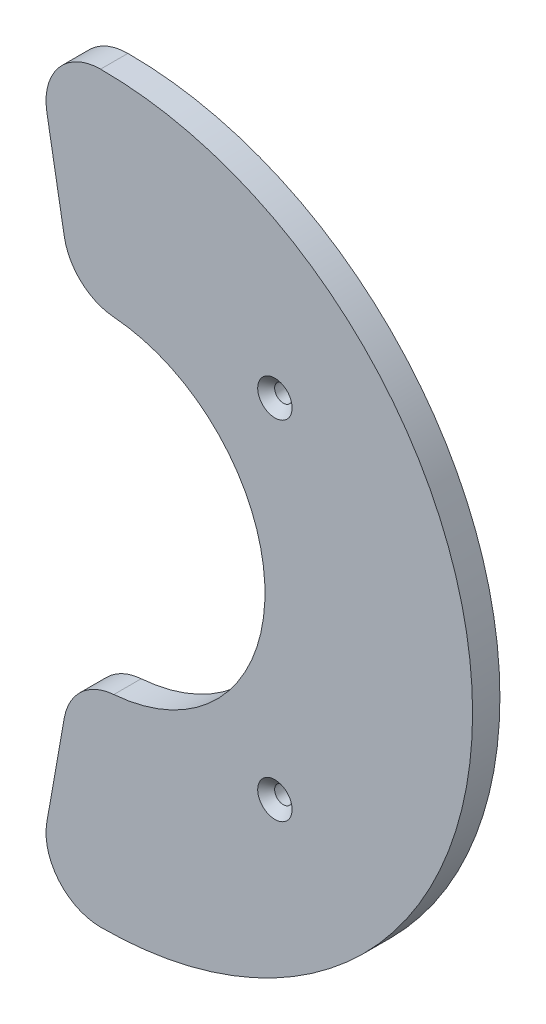
ISO-10303-21;
HEADER;
FILE_DESCRIPTION(('STEP AP214'),'2;1');
FILE_NAME('part.step','',(''),(''),'','','');
FILE_SCHEMA(('AUTOMOTIVE_DESIGN { 1 0 10303 214 1 1 1 1 }'));
ENDSEC;
DATA;
#1=APPLICATION_CONTEXT('core data for automotive mechanical design processes');
#2=APPLICATION_PROTOCOL_DEFINITION('international standard','automotive_design',2000,#1);
#3=PRODUCT_CONTEXT('',#1,'mechanical');
#4=PRODUCT('Part','Part','',(#3));
#5=PRODUCT_RELATED_PRODUCT_CATEGORY('part','',(#4));
#6=PRODUCT_DEFINITION_FORMATION('','',#4);
#7=PRODUCT_DEFINITION_CONTEXT('part definition',#1,'design');
#8=PRODUCT_DEFINITION('design','',#6,#7);
#9=PRODUCT_DEFINITION_SHAPE('','',#8);
#10=(LENGTH_UNIT() NAMED_UNIT(*) SI_UNIT(.MILLI.,.METRE.));
#11=(NAMED_UNIT(*) PLANE_ANGLE_UNIT() SI_UNIT($,.RADIAN.));
#12=(NAMED_UNIT(*) SI_UNIT($,.STERADIAN.) SOLID_ANGLE_UNIT());
#13=UNCERTAINTY_MEASURE_WITH_UNIT(LENGTH_MEASURE(1.E-05),#10,'distance_accuracy_value','');
#14=(GEOMETRIC_REPRESENTATION_CONTEXT(3) GLOBAL_UNCERTAINTY_ASSIGNED_CONTEXT((#13)) GLOBAL_UNIT_ASSIGNED_CONTEXT((#10,
#11,#12)) REPRESENTATION_CONTEXT('',''));
#15=CARTESIAN_POINT('',(0.,0.,0.));
#16=DIRECTION('',(0.,0.,1.));
#17=DIRECTION('',(1.,0.,0.));
#18=AXIS2_PLACEMENT_3D('',#15,#16,#17);
#19=CARTESIAN_POINT('',(31.8198051533946,31.8198051533947,5.));
#20=DIRECTION('',(0.,0.,-1.));
#21=DIRECTION('',(-1.,0.,0.));
#22=AXIS2_PLACEMENT_3D('',#19,#20,#21);
#23=CYLINDRICAL_SURFACE('',#22,1.6);
#24=CARTESIAN_POINT('',(31.8198051533946,31.8198051533947,3.45));
#25=DIRECTION('',(0.,0.,1.));
#26=DIRECTION('',(1.,0.,0.));
#27=AXIS2_PLACEMENT_3D('',#24,#25,#26);
#28=CIRCLE('',#27,1.6);
#29=CARTESIAN_POINT('',(33.4198051533946,31.8198051533947,3.45));
#30=VERTEX_POINT('',#29);
#31=EDGE_CURVE('E181',#30,#30,#28,.T.);
#32=ORIENTED_EDGE('',*,*,#31,.T.);
#33=EDGE_LOOP('',(#32));
#34=FACE_BOUND('',#33,.T.);
#35=CARTESIAN_POINT('',(31.8198051533946,31.8198051533947,1.));
#36=DIRECTION('',(0.,0.,-1.));
#37=DIRECTION('',(-1.,0.,0.));
#38=AXIS2_PLACEMENT_3D('',#35,#36,#37);
#39=CIRCLE('',#38,1.6);
#40=CARTESIAN_POINT('',(30.2198051533946,31.8198051533947,1.));
#41=VERTEX_POINT('',#40);
#42=EDGE_CURVE('E39',#41,#41,#39,.T.);
#43=ORIENTED_EDGE('',*,*,#42,.T.);
#44=EDGE_LOOP('',(#43));
#45=FACE_BOUND('',#44,.T.);
#46=ADVANCED_FACE('F35',(#34,#45),#23,.F.);
#47=CARTESIAN_POINT('',(31.8198051533946,-31.8198051533947,5.));
#48=DIRECTION('',(0.,0.,-1.));
#49=DIRECTION('',(-1.,0.,0.));
#50=AXIS2_PLACEMENT_3D('',#47,#48,#49);
#51=CYLINDRICAL_SURFACE('',#50,1.6);
#52=CARTESIAN_POINT('',(31.8198051533946,-31.8198051533947,1.));
#53=DIRECTION('',(0.,0.,1.));
#54=DIRECTION('',(1.,0.,0.));
#55=AXIS2_PLACEMENT_3D('',#52,#53,#54);
#56=CIRCLE('',#55,1.6);
#57=CARTESIAN_POINT('',(33.4198051533946,-31.8198051533947,1.));
#58=VERTEX_POINT('',#57);
#59=EDGE_CURVE('E158',#58,#58,#56,.T.);
#60=ORIENTED_EDGE('',*,*,#59,.F.);
#61=EDGE_LOOP('',(#60));
#62=FACE_BOUND('',#61,.T.);
#63=CARTESIAN_POINT('',(31.8198051533946,-31.8198051533947,3.45));
#64=DIRECTION('',(0.,0.,1.));
#65=DIRECTION('',(1.,0.,0.));
#66=AXIS2_PLACEMENT_3D('',#63,#64,#65);
#67=CIRCLE('',#66,1.6);
#68=CARTESIAN_POINT('',(33.4198051533946,-31.8198051533947,3.45));
#69=VERTEX_POINT('',#68);
#70=EDGE_CURVE('E187',#69,#69,#67,.T.);
#71=ORIENTED_EDGE('',*,*,#70,.T.);
#72=EDGE_LOOP('',(#71));
#73=FACE_BOUND('',#72,.T.);
#74=ADVANCED_FACE('F221',(#62,#73),#51,.F.);
#75=CARTESIAN_POINT('',(0.,0.,5.));
#76=DIRECTION('',(0.,0.,1.));
#77=DIRECTION('',(1.,0.,0.));
#78=AXIS2_PLACEMENT_3D('',#75,#76,#77);
#79=PLANE('',#78);
#80=CARTESIAN_POINT('',(31.8198051533946,31.8198051533947,5.));
#81=DIRECTION('',(0.,0.,1.));
#82=DIRECTION('',(1.,0.,0.));
#83=AXIS2_PLACEMENT_3D('',#80,#81,#82);
#84=CIRCLE('',#83,3.15);
#85=CARTESIAN_POINT('',(34.9698051533946,31.8198051533947,5.));
#86=VERTEX_POINT('',#85);
#87=EDGE_CURVE('E164',#86,#86,#84,.T.);
#88=ORIENTED_EDGE('',*,*,#87,.F.);
#89=EDGE_LOOP('',(#88));
#90=FACE_BOUND('',#89,.T.);
#91=CARTESIAN_POINT('',(31.8198051533946,-31.8198051533947,5.));
#92=DIRECTION('',(0.,0.,1.));
#93=DIRECTION('',(1.,0.,0.));
#94=AXIS2_PLACEMENT_3D('',#91,#92,#93);
#95=CIRCLE('',#94,3.15);
#96=CARTESIAN_POINT('',(34.9698051533946,-31.8198051533947,5.));
#97=VERTEX_POINT('',#96);
#98=EDGE_CURVE('E184',#97,#97,#95,.T.);
#99=ORIENTED_EDGE('',*,*,#98,.F.);
#100=EDGE_LOOP('',(#99));
#101=FACE_BOUND('',#100,.T.);
#102=DIRECTION('',(0.173648177666927,-0.984807753012209,0.));
#103=VECTOR('',#102,1.);
#104=CARTESIAN_POINT('',(-5.20944533000779,29.5442325903663,5.));
#105=LINE('',#104,#103);
#106=CARTESIAN_POINT('',(-9.92076826044199,56.2634726720863,5.));
#107=VERTEX_POINT('',#106);
#108=CARTESIAN_POINT('',(-6.72536500203273,38.1414402663223,5.));
#109=VERTEX_POINT('',#108);
#110=EDGE_CURVE('E192',#107,#109,#105,.T.);
#111=ORIENTED_EDGE('',*,*,#110,.T.);
#112=CARTESIAN_POINT('',(3.12271252808936,39.8779220429916,5.));
#113=DIRECTION('',(0.,0.,1.));
#114=DIRECTION('',(1.,0.,0.));
#115=AXIS2_PLACEMENT_3D('',#112,#113,#114);
#116=CIRCLE('',#115,10.);
#117=CARTESIAN_POINT('',(2.34203439606702,29.9084415322437,5.));
#118=VERTEX_POINT('',#117);
#119=EDGE_CURVE('E150',#109,#118,#116,.T.);
#120=ORIENTED_EDGE('',*,*,#119,.T.);
#121=CARTESIAN_POINT('',(0.,0.,5.));
#122=DIRECTION('',(0.,0.,-1.));
#123=DIRECTION('',(1.,0.,0.));
#124=AXIS2_PLACEMENT_3D('',#121,#122,#123);
#125=CIRCLE('',#124,30.);
#126=CARTESIAN_POINT('',(2.34203439606702,-29.9084415322437,5.));
#127=VERTEX_POINT('',#126);
#128=EDGE_CURVE('E121',#118,#127,#125,.T.);
#129=ORIENTED_EDGE('',*,*,#128,.T.);
#130=CARTESIAN_POINT('',(3.12271252808936,-39.8779220429916,5.));
#131=DIRECTION('',(0.,0.,1.));
#132=DIRECTION('',(1.,0.,0.));
#133=AXIS2_PLACEMENT_3D('',#130,#131,#132);
#134=CIRCLE('',#133,10.);
#135=CARTESIAN_POINT('',(-6.72536500203273,-38.1414402663223,5.));
#136=VERTEX_POINT('',#135);
#137=EDGE_CURVE('E57',#127,#136,#134,.T.);
#138=ORIENTED_EDGE('',*,*,#137,.T.);
#139=DIRECTION('',(-0.173648177666927,-0.984807753012209,0.));
#140=VECTOR('',#139,1.);
#141=CARTESIAN_POINT('',(-5.20944533000779,-29.5442325903663,5.));
#142=LINE('',#141,#140);
#143=CARTESIAN_POINT('',(-9.92076826044199,-56.2634726720863,5.));
#144=VERTEX_POINT('',#143);
#145=EDGE_CURVE('E136',#136,#144,#142,.T.);
#146=ORIENTED_EDGE('',*,*,#145,.T.);
#147=CARTESIAN_POINT('',(-0.0726907303199038,-57.9999544487556,5.));
#148=DIRECTION('',(0.,0.,1.));
#149=DIRECTION('',(1.,0.,0.));
#150=AXIS2_PLACEMENT_3D('',#147,#148,#149);
#151=CIRCLE('',#150,10.);
#152=CARTESIAN_POINT('',(-0.0852236148578182,-67.9999465950928,5.));
#153=VERTEX_POINT('',#152);
#154=EDGE_CURVE('E146',#144,#153,#151,.T.);
#155=ORIENTED_EDGE('',*,*,#154,.T.);
#156=CARTESIAN_POINT('',(0.,0.,5.));
#157=DIRECTION('',(0.,0.,1.));
#158=DIRECTION('',(1.,0.,0.));
#159=AXIS2_PLACEMENT_3D('',#156,#157,#158);
#160=CIRCLE('',#159,68.);
#161=CARTESIAN_POINT('',(-0.0852236148578182,67.9999465950928,5.));
#162=VERTEX_POINT('',#161);
#163=EDGE_CURVE('E130',#153,#162,#160,.T.);
#164=ORIENTED_EDGE('',*,*,#163,.T.);
#165=CARTESIAN_POINT('',(-0.0726907303199038,57.9999544487556,5.));
#166=DIRECTION('',(0.,0.,1.));
#167=DIRECTION('',(1.,0.,0.));
#168=AXIS2_PLACEMENT_3D('',#165,#166,#167);
#169=CIRCLE('',#168,10.);
#170=EDGE_CURVE('E148',#162,#107,#169,.T.);
#171=ORIENTED_EDGE('',*,*,#170,.T.);
#172=EDGE_LOOP('',(#111,#120,#129,#138,#146,#155,#164,#171));
#173=FACE_BOUND('',#172,.T.);
#174=ADVANCED_FACE('F208',(#90,#101,#173),#79,.T.);
#175=CARTESIAN_POINT('',(0.,0.,0.));
#176=DIRECTION('',(0.,0.,1.));
#177=DIRECTION('',(1.,0.,0.));
#178=AXIS2_PLACEMENT_3D('',#175,#176,#177);
#179=PLANE('',#178);
#180=CARTESIAN_POINT('',(31.8198051533946,31.8198051533947,0.));
#181=DIRECTION('',(0.,0.,-1.));
#182=DIRECTION('',(-1.,0.,0.));
#183=AXIS2_PLACEMENT_3D('',#180,#181,#182);
#184=CIRCLE('',#183,3.);
#185=CARTESIAN_POINT('',(28.8198051533946,31.8198051533947,0.));
#186=VERTEX_POINT('',#185);
#187=EDGE_CURVE('E166',#186,#186,#184,.T.);
#188=ORIENTED_EDGE('',*,*,#187,.F.);
#189=EDGE_LOOP('',(#188));
#190=FACE_BOUND('',#189,.T.);
#191=CARTESIAN_POINT('',(31.8198051533946,-31.8198051533947,0.));
#192=DIRECTION('',(0.,0.,-1.));
#193=DIRECTION('',(1.,0.,0.));
#194=AXIS2_PLACEMENT_3D('',#191,#192,#193);
#195=CIRCLE('',#194,3.);
#196=CARTESIAN_POINT('',(34.8198051533946,-31.8198051533947,0.));
#197=VERTEX_POINT('',#196);
#198=EDGE_CURVE('E176',#197,#197,#195,.T.);
#199=ORIENTED_EDGE('',*,*,#198,.F.);
#200=EDGE_LOOP('',(#199));
#201=FACE_BOUND('',#200,.T.);
#202=CARTESIAN_POINT('',(0.,0.,0.));
#203=DIRECTION('',(0.,0.,-1.));
#204=DIRECTION('',(1.,0.,0.));
#205=AXIS2_PLACEMENT_3D('',#202,#203,#204);
#206=CIRCLE('',#205,30.);
#207=CARTESIAN_POINT('',(2.34203439606702,29.9084415322437,0.));
#208=VERTEX_POINT('',#207);
#209=CARTESIAN_POINT('',(2.34203439606702,-29.9084415322437,0.));
#210=VERTEX_POINT('',#209);
#211=EDGE_CURVE('E119',#208,#210,#206,.T.);
#212=ORIENTED_EDGE('',*,*,#211,.F.);
#213=CARTESIAN_POINT('',(3.12271252808936,39.8779220429916,0.));
#214=DIRECTION('',(0.,0.,1.));
#215=DIRECTION('',(1.,0.,0.));
#216=AXIS2_PLACEMENT_3D('',#213,#214,#215);
#217=CIRCLE('',#216,10.);
#218=CARTESIAN_POINT('',(-6.72536500203273,38.1414402663223,0.));
#219=VERTEX_POINT('',#218);
#220=EDGE_CURVE('E102',#208,#219,#217,.F.);
#221=ORIENTED_EDGE('',*,*,#220,.T.);
#222=DIRECTION('',(0.173648177666927,-0.984807753012209,0.));
#223=VECTOR('',#222,1.);
#224=CARTESIAN_POINT('',(-5.20944533000779,29.5442325903663,0.));
#225=LINE('',#224,#223);
#226=CARTESIAN_POINT('',(-9.92076826044199,56.2634726720863,0.));
#227=VERTEX_POINT('',#226);
#228=EDGE_CURVE('E128',#227,#219,#225,.T.);
#229=ORIENTED_EDGE('',*,*,#228,.F.);
#230=CARTESIAN_POINT('',(-0.0726907303199038,57.9999544487556,0.));
#231=DIRECTION('',(0.,0.,1.));
#232=DIRECTION('',(1.,0.,0.));
#233=AXIS2_PLACEMENT_3D('',#230,#231,#232);
#234=CIRCLE('',#233,10.);
#235=CARTESIAN_POINT('',(-0.0852236148578182,67.9999465950928,0.));
#236=VERTEX_POINT('',#235);
#237=EDGE_CURVE('E113',#227,#236,#234,.F.);
#238=ORIENTED_EDGE('',*,*,#237,.T.);
#239=CARTESIAN_POINT('',(0.,0.,0.));
#240=DIRECTION('',(0.,0.,1.));
#241=DIRECTION('',(1.,0.,0.));
#242=AXIS2_PLACEMENT_3D('',#239,#240,#241);
#243=CIRCLE('',#242,68.);
#244=CARTESIAN_POINT('',(-0.0852236148578182,-67.9999465950928,0.));
#245=VERTEX_POINT('',#244);
#246=EDGE_CURVE('E132',#245,#236,#243,.T.);
#247=ORIENTED_EDGE('',*,*,#246,.F.);
#248=CARTESIAN_POINT('',(-0.0726907303199038,-57.9999544487556,0.));
#249=DIRECTION('',(0.,0.,1.));
#250=DIRECTION('',(1.,0.,0.));
#251=AXIS2_PLACEMENT_3D('',#248,#249,#250);
#252=CIRCLE('',#251,10.);
#253=CARTESIAN_POINT('',(-9.92076826044199,-56.2634726720863,0.));
#254=VERTEX_POINT('',#253);
#255=EDGE_CURVE('E139',#245,#254,#252,.F.);
#256=ORIENTED_EDGE('',*,*,#255,.T.);
#257=DIRECTION('',(-0.173648177666927,-0.984807753012209,0.));
#258=VECTOR('',#257,1.);
#259=CARTESIAN_POINT('',(-5.20944533000779,-29.5442325903663,0.));
#260=LINE('',#259,#258);
#261=CARTESIAN_POINT('',(-6.72536500203273,-38.1414402663223,0.));
#262=VERTEX_POINT('',#261);
#263=EDGE_CURVE('E127',#262,#254,#260,.T.);
#264=ORIENTED_EDGE('',*,*,#263,.F.);
#265=CARTESIAN_POINT('',(3.12271252808936,-39.8779220429916,0.));
#266=DIRECTION('',(0.,0.,1.));
#267=DIRECTION('',(1.,0.,0.));
#268=AXIS2_PLACEMENT_3D('',#265,#266,#267);
#269=CIRCLE('',#268,10.);
#270=EDGE_CURVE('E122',#262,#210,#269,.F.);
#271=ORIENTED_EDGE('',*,*,#270,.T.);
#272=EDGE_LOOP('',(#212,#221,#229,#238,#247,#256,#264,#271));
#273=FACE_BOUND('',#272,.T.);
#274=ADVANCED_FACE('F125',(#190,#201,#273),#179,.F.);
#275=CARTESIAN_POINT('',(0.,0.,5.));
#276=DIRECTION('',(0.,0.,-1.));
#277=DIRECTION('',(-1.,0.,0.));
#278=AXIS2_PLACEMENT_3D('',#275,#276,#277);
#279=CYLINDRICAL_SURFACE('',#278,68.);
#280=ORIENTED_EDGE('',*,*,#246,.T.);
#281=DIRECTION('',(0.,0.,-1.));
#282=VECTOR('',#281,1.);
#283=CARTESIAN_POINT('',(-0.0852236148578182,67.9999465950928,5.));
#284=LINE('',#283,#282);
#285=EDGE_CURVE('E155',#236,#162,#284,.F.);
#286=ORIENTED_EDGE('',*,*,#285,.T.);
#287=ORIENTED_EDGE('',*,*,#163,.F.);
#288=DIRECTION('',(0.,0.,-1.));
#289=VECTOR('',#288,1.);
#290=CARTESIAN_POINT('',(-0.0852236148578182,-67.9999465950928,5.));
#291=LINE('',#290,#289);
#292=EDGE_CURVE('E152',#153,#245,#291,.T.);
#293=ORIENTED_EDGE('',*,*,#292,.T.);
#294=EDGE_LOOP('',(#280,#286,#287,#293));
#295=FACE_BOUND('',#294,.T.);
#296=ADVANCED_FACE('F200',(#295),#279,.T.);
#297=CARTESIAN_POINT('',(-5.20944533000779,29.5442325903663,5.));
#298=DIRECTION('',(0.984807753012209,0.173648177666927,0.));
#299=DIRECTION('',(-0.173648177666927,0.984807753012209,0.));
#300=AXIS2_PLACEMENT_3D('',#297,#298,#299);
#301=PLANE('',#300);
#302=ORIENTED_EDGE('',*,*,#228,.T.);
#303=DIRECTION('',(0.,0.,-1.));
#304=VECTOR('',#303,1.);
#305=CARTESIAN_POINT('',(-6.72536500203273,38.1414402663223,5.));
#306=LINE('',#305,#304);
#307=EDGE_CURVE('E107',#219,#109,#306,.F.);
#308=ORIENTED_EDGE('',*,*,#307,.T.);
#309=ORIENTED_EDGE('',*,*,#110,.F.);
#310=DIRECTION('',(0.,0.,-1.));
#311=VECTOR('',#310,1.);
#312=CARTESIAN_POINT('',(-9.92076826044199,56.2634726720863,5.));
#313=LINE('',#312,#311);
#314=EDGE_CURVE('E112',#107,#227,#313,.T.);
#315=ORIENTED_EDGE('',*,*,#314,.T.);
#316=EDGE_LOOP('',(#302,#308,#309,#315));
#317=FACE_BOUND('',#316,.T.);
#318=ADVANCED_FACE('F210',(#317),#301,.F.);
#319=CARTESIAN_POINT('',(0.,0.,5.));
#320=DIRECTION('',(0.,0.,-1.));
#321=DIRECTION('',(-1.,0.,0.));
#322=AXIS2_PLACEMENT_3D('',#319,#320,#321);
#323=CYLINDRICAL_SURFACE('',#322,30.);
#324=ORIENTED_EDGE('',*,*,#128,.F.);
#325=DIRECTION('',(0.,0.,-1.));
#326=VECTOR('',#325,1.);
#327=CARTESIAN_POINT('',(2.34203439606702,29.9084415322437,5.));
#328=LINE('',#327,#326);
#329=EDGE_CURVE('E106',#118,#208,#328,.T.);
#330=ORIENTED_EDGE('',*,*,#329,.T.);
#331=ORIENTED_EDGE('',*,*,#211,.T.);
#332=DIRECTION('',(0.,0.,-1.));
#333=VECTOR('',#332,1.);
#334=CARTESIAN_POINT('',(2.34203439606702,-29.9084415322437,5.));
#335=LINE('',#334,#333);
#336=EDGE_CURVE('E123',#210,#127,#335,.F.);
#337=ORIENTED_EDGE('',*,*,#336,.T.);
#338=EDGE_LOOP('',(#324,#330,#331,#337));
#339=FACE_BOUND('',#338,.T.);
#340=ADVANCED_FACE('F118',(#339),#323,.F.);
#341=CARTESIAN_POINT('',(-5.20944533000779,-29.5442325903663,5.));
#342=DIRECTION('',(0.984807753012209,-0.173648177666927,0.));
#343=DIRECTION('',(0.173648177666927,0.984807753012209,0.));
#344=AXIS2_PLACEMENT_3D('',#341,#342,#343);
#345=PLANE('',#344);
#346=ORIENTED_EDGE('',*,*,#263,.T.);
#347=DIRECTION('',(0.,0.,-1.));
#348=VECTOR('',#347,1.);
#349=CARTESIAN_POINT('',(-9.92076826044199,-56.2634726720863,5.));
#350=LINE('',#349,#348);
#351=EDGE_CURVE('E11',#254,#144,#350,.F.);
#352=ORIENTED_EDGE('',*,*,#351,.T.);
#353=ORIENTED_EDGE('',*,*,#145,.F.);
#354=DIRECTION('',(0.,0.,-1.));
#355=VECTOR('',#354,1.);
#356=CARTESIAN_POINT('',(-6.72536500203273,-38.1414402663223,5.));
#357=LINE('',#356,#355);
#358=EDGE_CURVE('E44',#136,#262,#357,.T.);
#359=ORIENTED_EDGE('',*,*,#358,.T.);
#360=EDGE_LOOP('',(#346,#352,#353,#359));
#361=FACE_BOUND('',#360,.T.);
#362=ADVANCED_FACE('F217',(#361),#345,.F.);
#363=CARTESIAN_POINT('',(3.12271252808936,39.8779220429916,5.));
#364=DIRECTION('',(0.,0.,-1.));
#365=DIRECTION('',(-1.,0.,0.));
#366=AXIS2_PLACEMENT_3D('',#363,#364,#365);
#367=CYLINDRICAL_SURFACE('',#366,10.);
#368=ORIENTED_EDGE('',*,*,#119,.F.);
#369=ORIENTED_EDGE('',*,*,#307,.F.);
#370=ORIENTED_EDGE('',*,*,#220,.F.);
#371=ORIENTED_EDGE('',*,*,#329,.F.);
#372=EDGE_LOOP('',(#368,#369,#370,#371));
#373=FACE_BOUND('',#372,.T.);
#374=ADVANCED_FACE('F105',(#373),#367,.T.);
#375=CARTESIAN_POINT('',(-0.0726907303199038,57.9999544487556,5.));
#376=DIRECTION('',(0.,0.,-1.));
#377=DIRECTION('',(-1.,0.,0.));
#378=AXIS2_PLACEMENT_3D('',#375,#376,#377);
#379=CYLINDRICAL_SURFACE('',#378,10.);
#380=ORIENTED_EDGE('',*,*,#170,.F.);
#381=ORIENTED_EDGE('',*,*,#285,.F.);
#382=ORIENTED_EDGE('',*,*,#237,.F.);
#383=ORIENTED_EDGE('',*,*,#314,.F.);
#384=EDGE_LOOP('',(#380,#381,#382,#383));
#385=FACE_BOUND('',#384,.T.);
#386=ADVANCED_FACE('F205',(#385),#379,.T.);
#387=CARTESIAN_POINT('',(-0.0726907303199038,-57.9999544487556,5.));
#388=DIRECTION('',(0.,0.,-1.));
#389=DIRECTION('',(-1.,0.,0.));
#390=AXIS2_PLACEMENT_3D('',#387,#388,#389);
#391=CYLINDRICAL_SURFACE('',#390,10.);
#392=ORIENTED_EDGE('',*,*,#154,.F.);
#393=ORIENTED_EDGE('',*,*,#351,.F.);
#394=ORIENTED_EDGE('',*,*,#255,.F.);
#395=ORIENTED_EDGE('',*,*,#292,.F.);
#396=EDGE_LOOP('',(#392,#393,#394,#395));
#397=FACE_BOUND('',#396,.T.);
#398=ADVANCED_FACE('F246',(#397),#391,.T.);
#399=CARTESIAN_POINT('',(3.12271252808936,-39.8779220429916,5.));
#400=DIRECTION('',(0.,0.,-1.));
#401=DIRECTION('',(-1.,0.,0.));
#402=AXIS2_PLACEMENT_3D('',#399,#400,#401);
#403=CYLINDRICAL_SURFACE('',#402,10.);
#404=ORIENTED_EDGE('',*,*,#137,.F.);
#405=ORIENTED_EDGE('',*,*,#336,.F.);
#406=ORIENTED_EDGE('',*,*,#270,.F.);
#407=ORIENTED_EDGE('',*,*,#358,.F.);
#408=EDGE_LOOP('',(#404,#405,#406,#407));
#409=FACE_BOUND('',#408,.T.);
#410=ADVANCED_FACE('F37',(#409),#403,.T.);
#411=CARTESIAN_POINT('',(31.8198051533946,-31.8198051533947,5.));
#412=DIRECTION('',(0.,0.,1.));
#413=DIRECTION('',(1.,0.,0.));
#414=AXIS2_PLACEMENT_3D('',#411,#412,#413);
#415=CONICAL_SURFACE('',#414,3.15,0.785398163397448);
#416=ORIENTED_EDGE('',*,*,#70,.F.);
#417=EDGE_LOOP('',(#416));
#418=FACE_BOUND('',#417,.T.);
#419=ORIENTED_EDGE('',*,*,#98,.T.);
#420=EDGE_LOOP('',(#419));
#421=FACE_BOUND('',#420,.T.);
#422=ADVANCED_FACE('F249',(#418,#421),#415,.F.);
#423=CARTESIAN_POINT('',(31.8198051533946,31.8198051533947,5.));
#424=DIRECTION('',(0.,0.,1.));
#425=DIRECTION('',(1.,0.,0.));
#426=AXIS2_PLACEMENT_3D('',#423,#424,#425);
#427=CONICAL_SURFACE('',#426,3.15,0.785398163397448);
#428=ORIENTED_EDGE('',*,*,#31,.F.);
#429=EDGE_LOOP('',(#428));
#430=FACE_BOUND('',#429,.T.);
#431=ORIENTED_EDGE('',*,*,#87,.T.);
#432=EDGE_LOOP('',(#431));
#433=FACE_BOUND('',#432,.T.);
#434=ADVANCED_FACE('F254',(#430,#433),#427,.F.);
#435=CARTESIAN_POINT('',(31.8198051533946,-31.8198051533947,1.));
#436=DIRECTION('',(0.,0.,-1.));
#437=DIRECTION('',(-1.,0.,0.));
#438=AXIS2_PLACEMENT_3D('',#435,#436,#437);
#439=CYLINDRICAL_SURFACE('',#438,3.);
#440=CARTESIAN_POINT('',(31.8198051533946,-31.8198051533947,1.));
#441=DIRECTION('',(0.,0.,-1.));
#442=DIRECTION('',(1.,0.,0.));
#443=AXIS2_PLACEMENT_3D('',#440,#441,#442);
#444=CIRCLE('',#443,3.);
#445=CARTESIAN_POINT('',(34.8198051533946,-31.8198051533947,1.));
#446=VERTEX_POINT('',#445);
#447=EDGE_CURVE('E171',#446,#446,#444,.T.);
#448=ORIENTED_EDGE('',*,*,#447,.F.);
#449=EDGE_LOOP('',(#448));
#450=FACE_BOUND('',#449,.T.);
#451=ORIENTED_EDGE('',*,*,#198,.T.);
#452=EDGE_LOOP('',(#451));
#453=FACE_BOUND('',#452,.T.);
#454=ADVANCED_FACE('F317',(#450,#453),#439,.F.);
#455=CARTESIAN_POINT('',(31.8198051533946,-31.8198051533947,1.));
#456=DIRECTION('',(0.,0.,1.));
#457=DIRECTION('',(1.,0.,0.));
#458=AXIS2_PLACEMENT_3D('',#455,#456,#457);
#459=PLANE('',#458);
#460=ORIENTED_EDGE('',*,*,#59,.T.);
#461=EDGE_LOOP('',(#460));
#462=FACE_BOUND('',#461,.T.);
#463=ORIENTED_EDGE('',*,*,#447,.T.);
#464=EDGE_LOOP('',(#463));
#465=FACE_BOUND('',#464,.T.);
#466=ADVANCED_FACE('F330',(#462,#465),#459,.F.);
#467=CARTESIAN_POINT('',(31.8198051533946,31.8198051533947,1.));
#468=DIRECTION('',(0.,0.,-1.));
#469=DIRECTION('',(-1.,0.,0.));
#470=AXIS2_PLACEMENT_3D('',#467,#468,#469);
#471=CYLINDRICAL_SURFACE('',#470,3.);
#472=CARTESIAN_POINT('',(31.8198051533946,31.8198051533947,1.));
#473=DIRECTION('',(0.,0.,-1.));
#474=DIRECTION('',(-1.,0.,0.));
#475=AXIS2_PLACEMENT_3D('',#472,#473,#474);
#476=CIRCLE('',#475,3.);
#477=CARTESIAN_POINT('',(28.8198051533946,31.8198051533947,1.));
#478=VERTEX_POINT('',#477);
#479=EDGE_CURVE('E160',#478,#478,#476,.T.);
#480=ORIENTED_EDGE('',*,*,#479,.F.);
#481=EDGE_LOOP('',(#480));
#482=FACE_BOUND('',#481,.T.);
#483=ORIENTED_EDGE('',*,*,#187,.T.);
#484=EDGE_LOOP('',(#483));
#485=FACE_BOUND('',#484,.T.);
#486=ADVANCED_FACE('F337',(#482,#485),#471,.F.);
#487=CARTESIAN_POINT('',(31.8198051533946,31.8198051533947,1.));
#488=DIRECTION('',(0.,0.,-1.));
#489=DIRECTION('',(-1.,0.,0.));
#490=AXIS2_PLACEMENT_3D('',#487,#488,#489);
#491=PLANE('',#490);
#492=ORIENTED_EDGE('',*,*,#42,.F.);
#493=EDGE_LOOP('',(#492));
#494=FACE_BOUND('',#493,.T.);
#495=ORIENTED_EDGE('',*,*,#479,.T.);
#496=EDGE_LOOP('',(#495));
#497=FACE_BOUND('',#496,.T.);
#498=ADVANCED_FACE('F344',(#494,#497),#491,.T.);
#499=CLOSED_SHELL('',(#46,#74,#174,#274,#296,#318,#340,#362,#374,#386,#398,#410,#422,#434,#454,
#466,#486,#498));
#500=MANIFOLD_SOLID_BREP('B2',#499);
#501=ADVANCED_BREP_SHAPE_REPRESENTATION('',(#18,#500),#14);
#502=SHAPE_DEFINITION_REPRESENTATION(#9,#501);
ENDSEC;
END-ISO-10303-21;
